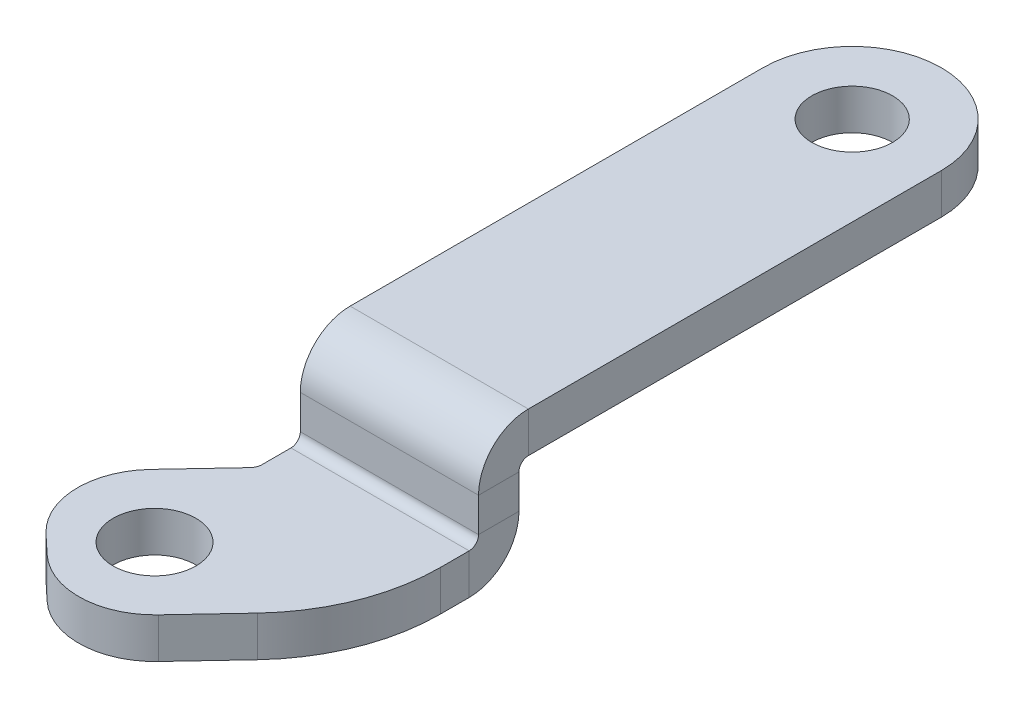
ISO-10303-21;
HEADER;
FILE_DESCRIPTION(('STEP AP214'),'2;1');
FILE_NAME('part.step','',(''),(''),'','','');
FILE_SCHEMA(('AUTOMOTIVE_DESIGN { 1 0 10303 214 1 1 1 1 }'));
ENDSEC;
DATA;
#1=APPLICATION_CONTEXT('core data for automotive mechanical design processes');
#2=APPLICATION_PROTOCOL_DEFINITION('international standard','automotive_design',2000,#1);
#3=PRODUCT_CONTEXT('',#1,'mechanical');
#4=PRODUCT('Part','Part','',(#3));
#5=PRODUCT_RELATED_PRODUCT_CATEGORY('part','',(#4));
#6=PRODUCT_DEFINITION_FORMATION('','',#4);
#7=PRODUCT_DEFINITION_CONTEXT('part definition',#1,'design');
#8=PRODUCT_DEFINITION('design','',#6,#7);
#9=PRODUCT_DEFINITION_SHAPE('','',#8);
#10=(LENGTH_UNIT() NAMED_UNIT(*) SI_UNIT(.MILLI.,.METRE.));
#11=(NAMED_UNIT(*) PLANE_ANGLE_UNIT() SI_UNIT($,.RADIAN.));
#12=(NAMED_UNIT(*) SI_UNIT($,.STERADIAN.) SOLID_ANGLE_UNIT());
#13=UNCERTAINTY_MEASURE_WITH_UNIT(LENGTH_MEASURE(1.E-05),#10,'distance_accuracy_value','');
#14=(GEOMETRIC_REPRESENTATION_CONTEXT(3) GLOBAL_UNCERTAINTY_ASSIGNED_CONTEXT((#13)) GLOBAL_UNIT_ASSIGNED_CONTEXT((#10,
#11,#12)) REPRESENTATION_CONTEXT('',''));
#15=CARTESIAN_POINT('',(0.,0.,0.));
#16=DIRECTION('',(0.,0.,1.));
#17=DIRECTION('',(1.,0.,0.));
#18=AXIS2_PLACEMENT_3D('',#15,#16,#17);
#19=CARTESIAN_POINT('',(0.,7.32499481379612,0.));
#20=DIRECTION('',(0.,-1.,0.));
#21=DIRECTION('',(0.,0.,-1.));
#22=AXIS2_PLACEMENT_3D('',#19,#20,#21);
#23=PLANE('',#22);
#24=DIRECTION('',(0.,0.,-1.));
#25=VECTOR('',#24,1.);
#26=CARTESIAN_POINT('',(12.9500036071504,7.32499481379612,0.));
#27=LINE('',#26,#25);
#28=CARTESIAN_POINT('',(12.9500036071504,7.32499481379612,-16.4116));
#29=VERTEX_POINT('',#28);
#30=CARTESIAN_POINT('',(12.9500036071504,7.32499481379612,-48.8499986312992));
#31=VERTEX_POINT('',#30);
#32=EDGE_CURVE('E261',#29,#31,#27,.T.);
#33=ORIENTED_EDGE('',*,*,#32,.T.);
#34=CARTESIAN_POINT('',(5.9500036071504,7.32499481379612,-48.8499986312992));
#35=DIRECTION('',(0.,1.,0.));
#36=DIRECTION('',(0.,0.,1.));
#37=AXIS2_PLACEMENT_3D('',#34,#35,#36);
#38=CIRCLE('',#37,7.);
#39=CARTESIAN_POINT('',(-1.0499963928496,7.32499481379612,-48.8499986312992));
#40=VERTEX_POINT('',#39);
#41=EDGE_CURVE('E244',#40,#31,#38,.F.);
#42=ORIENTED_EDGE('',*,*,#41,.F.);
#43=DIRECTION('',(0.,0.,1.));
#44=VECTOR('',#43,1.);
#45=CARTESIAN_POINT('',(-1.04999639284959,7.32499481379612,0.));
#46=LINE('',#45,#44);
#47=CARTESIAN_POINT('',(-1.0499963928496,7.32499481379612,-16.4116));
#48=VERTEX_POINT('',#47);
#49=EDGE_CURVE('E259',#40,#48,#46,.T.);
#50=ORIENTED_EDGE('',*,*,#49,.T.);
#51=DIRECTION('',(1.,0.,0.));
#52=VECTOR('',#51,1.);
#53=CARTESIAN_POINT('',(-1.0499963928496,7.32499481379612,-16.4116));
#54=LINE('',#53,#52);
#55=EDGE_CURVE('E263',#29,#48,#54,.F.);
#56=ORIENTED_EDGE('',*,*,#55,.F.);
#57=EDGE_LOOP('',(#33,#42,#50,#56));
#58=FACE_BOUND('',#57,.T.);
#59=CARTESIAN_POINT('',(5.9500036071504,7.32499481379612,-48.8499986312992));
#60=DIRECTION('',(0.,1.,0.));
#61=DIRECTION('',(0.,0.,1.));
#62=AXIS2_PLACEMENT_3D('',#59,#60,#61);
#63=CIRCLE('',#62,3.175);
#64=CARTESIAN_POINT('',(5.9500036071504,7.32499481379612,-45.6749986312992));
#65=VERTEX_POINT('',#64);
#66=EDGE_CURVE('E794',#65,#65,#63,.T.);
#67=ORIENTED_EDGE('',*,*,#66,.F.);
#68=EDGE_LOOP('',(#67));
#69=FACE_BOUND('',#68,.T.);
#70=ADVANCED_FACE('F105',(#58,#69),#23,.F.);
#71=CARTESIAN_POINT('',(0.,4.14999481379613,0.));
#72=DIRECTION('',(0.,-1.,0.));
#73=DIRECTION('',(0.,0.,-1.));
#74=AXIS2_PLACEMENT_3D('',#71,#72,#73);
#75=PLANE('',#74);
#76=CARTESIAN_POINT('',(5.9500036071504,4.14999481379612,-48.8499986312992));
#77=DIRECTION('',(0.,1.,0.));
#78=DIRECTION('',(0.,0.,1.));
#79=AXIS2_PLACEMENT_3D('',#76,#77,#78);
#80=CIRCLE('',#79,7.);
#81=CARTESIAN_POINT('',(-1.0499963928496,4.14999481379612,-48.8499986312992));
#82=VERTEX_POINT('',#81);
#83=CARTESIAN_POINT('',(12.9500036071504,4.14999481379612,-48.8499986312992));
#84=VERTEX_POINT('',#83);
#85=EDGE_CURVE('E233',#82,#84,#80,.F.);
#86=ORIENTED_EDGE('',*,*,#85,.T.);
#87=DIRECTION('',(0.,0.,1.));
#88=VECTOR('',#87,1.);
#89=CARTESIAN_POINT('',(12.9500036071504,4.14999481379612,-55.8499986312992));
#90=LINE('',#89,#88);
#91=CARTESIAN_POINT('',(12.9500036071504,4.14999481379612,-16.4116));
#92=VERTEX_POINT('',#91);
#93=EDGE_CURVE('E239',#92,#84,#90,.F.);
#94=ORIENTED_EDGE('',*,*,#93,.F.);
#95=DIRECTION('',(1.,0.,0.));
#96=VECTOR('',#95,1.);
#97=CARTESIAN_POINT('',(-1.0499963928496,4.14999481379612,-16.4116));
#98=LINE('',#97,#96);
#99=CARTESIAN_POINT('',(-1.0499963928496,4.14999481379612,-16.4116));
#100=VERTEX_POINT('',#99);
#101=EDGE_CURVE('E269',#100,#92,#98,.T.);
#102=ORIENTED_EDGE('',*,*,#101,.F.);
#103=DIRECTION('',(0.,0.,-1.));
#104=VECTOR('',#103,1.);
#105=CARTESIAN_POINT('',(-1.0499963928496,4.14999481379612,-15.675));
#106=LINE('',#105,#104);
#107=EDGE_CURVE('E240',#82,#100,#106,.F.);
#108=ORIENTED_EDGE('',*,*,#107,.F.);
#109=EDGE_LOOP('',(#86,#94,#102,#108));
#110=FACE_BOUND('',#109,.T.);
#111=CARTESIAN_POINT('',(5.9500036071504,4.14999481379612,-48.8499986312992));
#112=DIRECTION('',(0.,1.,0.));
#113=DIRECTION('',(0.,0.,1.));
#114=AXIS2_PLACEMENT_3D('',#111,#112,#113);
#115=CIRCLE('',#114,3.175);
#116=CARTESIAN_POINT('',(5.9500036071504,4.14999481379612,-45.6749986312992));
#117=VERTEX_POINT('',#116);
#118=EDGE_CURVE('E253',#117,#117,#115,.T.);
#119=ORIENTED_EDGE('',*,*,#118,.T.);
#120=EDGE_LOOP('',(#119));
#121=FACE_BOUND('',#120,.T.);
#122=ADVANCED_FACE('F235',(#110,#121),#75,.T.);
#123=CARTESIAN_POINT('',(12.9500036071504,7.32499481379612,-55.8499986312992));
#124=DIRECTION('',(-1.,0.,0.));
#125=DIRECTION('',(0.,0.,1.));
#126=AXIS2_PLACEMENT_3D('',#123,#124,#125);
#127=PLANE('',#126);
#128=DIRECTION('',(0.,1.,0.));
#129=VECTOR('',#128,1.);
#130=CARTESIAN_POINT('',(12.9500036071504,4.14999481379612,-48.8499986312992));
#131=LINE('',#130,#129);
#132=EDGE_CURVE('E247',#84,#31,#131,.T.);
#133=ORIENTED_EDGE('',*,*,#132,.T.);
#134=ORIENTED_EDGE('',*,*,#32,.F.);
#135=DIRECTION('',(0.,-1.,0.));
#136=VECTOR('',#135,1.);
#137=CARTESIAN_POINT('',(12.9500036071504,4.14999481379612,-16.4116));
#138=LINE('',#137,#136);
#139=EDGE_CURVE('E258',#92,#29,#138,.F.);
#140=ORIENTED_EDGE('',*,*,#139,.F.);
#141=ORIENTED_EDGE('',*,*,#93,.T.);
#142=EDGE_LOOP('',(#133,#134,#140,#141));
#143=FACE_BOUND('',#142,.T.);
#144=ADVANCED_FACE('F256',(#143),#127,.F.);
#145=CARTESIAN_POINT('',(12.9500036071504,0.,-15.675));
#146=DIRECTION('',(-1.,0.,0.));
#147=DIRECTION('',(0.,0.,1.));
#148=AXIS2_PLACEMENT_3D('',#145,#146,#147);
#149=PLANE('',#148);
#150=DIRECTION('',(0.,0.,1.));
#151=VECTOR('',#150,1.);
#152=CARTESIAN_POINT('',(12.9500036071504,3.41339481379613,-15.675));
#153=LINE('',#152,#151);
#154=CARTESIAN_POINT('',(12.9500036071504,3.41339481379613,-15.675));
#155=VERTEX_POINT('',#154);
#156=CARTESIAN_POINT('',(12.9500036071504,3.41339481379614,-12.5));
#157=VERTEX_POINT('',#156);
#158=EDGE_CURVE('E279',#155,#157,#153,.T.);
#159=ORIENTED_EDGE('',*,*,#158,.T.);
#160=DIRECTION('',(0.,-1.,0.));
#161=VECTOR('',#160,1.);
#162=CARTESIAN_POINT('',(12.9500036071504,0.,-12.5));
#163=LINE('',#162,#161);
#164=CARTESIAN_POINT('',(12.9500036071504,0.736599999999989,-12.5));
#165=VERTEX_POINT('',#164);
#166=EDGE_CURVE('E305',#157,#165,#163,.T.);
#167=ORIENTED_EDGE('',*,*,#166,.T.);
#168=DIRECTION('',(0.,0.,-1.));
#169=VECTOR('',#168,1.);
#170=CARTESIAN_POINT('',(12.9500036071504,0.736599999999997,-12.5));
#171=LINE('',#170,#169);
#172=CARTESIAN_POINT('',(12.9500036071504,0.736599999999978,-15.675));
#173=VERTEX_POINT('',#172);
#174=EDGE_CURVE('E292',#165,#173,#171,.T.);
#175=ORIENTED_EDGE('',*,*,#174,.T.);
#176=DIRECTION('',(0.,-1.,0.));
#177=VECTOR('',#176,1.);
#178=CARTESIAN_POINT('',(12.9500036071504,0.,-15.675));
#179=LINE('',#178,#177);
#180=EDGE_CURVE('E306',#155,#173,#179,.T.);
#181=ORIENTED_EDGE('',*,*,#180,.F.);
#182=EDGE_LOOP('',(#159,#167,#175,#181));
#183=FACE_BOUND('',#182,.T.);
#184=ADVANCED_FACE('F437',(#183),#149,.F.);
#185=CARTESIAN_POINT('',(-1.0499963928496,7.32499481379612,-15.675));
#186=DIRECTION('',(1.,0.,0.));
#187=DIRECTION('',(0.,0.,-1.));
#188=AXIS2_PLACEMENT_3D('',#185,#186,#187);
#189=PLANE('',#188);
#190=DIRECTION('',(0.,0.,1.));
#191=VECTOR('',#190,1.);
#192=CARTESIAN_POINT('',(-1.0499963928496,3.41339481379613,-15.675));
#193=LINE('',#192,#191);
#194=CARTESIAN_POINT('',(-1.0499963928496,3.41339481379613,-15.675));
#195=VERTEX_POINT('',#194);
#196=CARTESIAN_POINT('',(-1.0499963928496,3.41339481379613,-12.5));
#197=VERTEX_POINT('',#196);
#198=EDGE_CURVE('E290',#195,#197,#193,.T.);
#199=ORIENTED_EDGE('',*,*,#198,.F.);
#200=DIRECTION('',(0.,1.,0.));
#201=VECTOR('',#200,1.);
#202=CARTESIAN_POINT('',(-1.0499963928496,7.32499481379612,-15.675));
#203=LINE('',#202,#201);
#204=CARTESIAN_POINT('',(-1.0499963928496,0.736600000000019,-15.675));
#205=VERTEX_POINT('',#204);
#206=EDGE_CURVE('E308',#205,#195,#203,.T.);
#207=ORIENTED_EDGE('',*,*,#206,.F.);
#208=DIRECTION('',(0.,0.,-1.));
#209=VECTOR('',#208,1.);
#210=CARTESIAN_POINT('',(-1.0499963928496,0.736599999999997,-12.5));
#211=LINE('',#210,#209);
#212=CARTESIAN_POINT('',(-1.0499963928496,0.736599999999989,-12.5));
#213=VERTEX_POINT('',#212);
#214=EDGE_CURVE('E297',#213,#205,#211,.T.);
#215=ORIENTED_EDGE('',*,*,#214,.F.);
#216=DIRECTION('',(0.,1.,0.));
#217=VECTOR('',#216,1.);
#218=CARTESIAN_POINT('',(-1.0499963928496,7.32499481379613,-12.5));
#219=LINE('',#218,#217);
#220=EDGE_CURVE('E309',#213,#197,#219,.T.);
#221=ORIENTED_EDGE('',*,*,#220,.T.);
#222=EDGE_LOOP('',(#199,#207,#215,#221));
#223=FACE_BOUND('',#222,.T.);
#224=ADVANCED_FACE('F450',(#223),#189,.F.);
#225=CARTESIAN_POINT('',(0.,0.,-15.675));
#226=DIRECTION('',(0.,0.,1.));
#227=DIRECTION('',(0.,-1.,0.));
#228=AXIS2_PLACEMENT_3D('',#225,#226,#227);
#229=PLANE('',#228);
#230=DIRECTION('',(1.,0.,0.));
#231=VECTOR('',#230,1.);
#232=CARTESIAN_POINT('',(12.9500036071504,3.41339481379613,-15.675));
#233=LINE('',#232,#231);
#234=EDGE_CURVE('E285',#155,#195,#233,.F.);
#235=ORIENTED_EDGE('',*,*,#234,.F.);
#236=ORIENTED_EDGE('',*,*,#180,.T.);
#237=DIRECTION('',(1.,0.,0.));
#238=VECTOR('',#237,1.);
#239=CARTESIAN_POINT('',(0.,0.736600000000019,-15.675));
#240=LINE('',#239,#238);
#241=EDGE_CURVE('E300',#205,#173,#240,.T.);
#242=ORIENTED_EDGE('',*,*,#241,.F.);
#243=ORIENTED_EDGE('',*,*,#206,.T.);
#244=EDGE_LOOP('',(#235,#236,#242,#243));
#245=FACE_BOUND('',#244,.T.);
#246=ADVANCED_FACE('F453',(#245),#229,.F.);
#247=CARTESIAN_POINT('',(0.,0.,-12.5));
#248=DIRECTION('',(0.,0.,1.));
#249=DIRECTION('',(0.,-1.,0.));
#250=AXIS2_PLACEMENT_3D('',#247,#248,#249);
#251=PLANE('',#250);
#252=ORIENTED_EDGE('',*,*,#166,.F.);
#253=DIRECTION('',(1.,0.,0.));
#254=VECTOR('',#253,1.);
#255=CARTESIAN_POINT('',(12.9500036071504,3.41339481379614,-12.5));
#256=LINE('',#255,#254);
#257=EDGE_CURVE('E274',#157,#197,#256,.F.);
#258=ORIENTED_EDGE('',*,*,#257,.T.);
#259=ORIENTED_EDGE('',*,*,#220,.F.);
#260=DIRECTION('',(-1.,0.,0.));
#261=VECTOR('',#260,1.);
#262=CARTESIAN_POINT('',(12.9500036071504,0.736599999999997,-12.5));
#263=LINE('',#262,#261);
#264=EDGE_CURVE('E295',#165,#213,#263,.T.);
#265=ORIENTED_EDGE('',*,*,#264,.F.);
#266=EDGE_LOOP('',(#252,#258,#259,#265));
#267=FACE_BOUND('',#266,.T.);
#268=ADVANCED_FACE('F440',(#267),#251,.T.);
#269=CARTESIAN_POINT('',(-1.0499963928496,-3.175,-9.50000000000001));
#270=DIRECTION('',(-1.,0.,0.));
#271=DIRECTION('',(0.,0.,1.));
#272=AXIS2_PLACEMENT_3D('',#269,#270,#271);
#273=PLANE('',#272);
#274=DIRECTION('',(0.,0.,1.));
#275=VECTOR('',#274,1.);
#276=CARTESIAN_POINT('',(-1.0499963928496,0.,-9.50000000000001));
#277=LINE('',#276,#275);
#278=CARTESIAN_POINT('',(-1.0499963928496,0.,-11.7634));
#279=VERTEX_POINT('',#278);
#280=CARTESIAN_POINT('',(-1.0499963928496,0.,-9.50000000000001));
#281=VERTEX_POINT('',#280);
#282=EDGE_CURVE('E380',#279,#281,#277,.T.);
#283=ORIENTED_EDGE('',*,*,#282,.F.);
#284=DIRECTION('',(0.,-1.,0.));
#285=VECTOR('',#284,1.);
#286=CARTESIAN_POINT('',(-1.0499963928496,0.,-11.7634));
#287=LINE('',#286,#285);
#288=CARTESIAN_POINT('',(-1.0499963928496,-3.17500000000001,-11.7634));
#289=VERTEX_POINT('',#288);
#290=EDGE_CURVE('E322',#279,#289,#287,.T.);
#291=ORIENTED_EDGE('',*,*,#290,.T.);
#292=DIRECTION('',(0.,0.,1.));
#293=VECTOR('',#292,1.);
#294=CARTESIAN_POINT('',(-1.0499963928496,-3.175,-9.50000000000001));
#295=LINE('',#294,#293);
#296=CARTESIAN_POINT('',(-1.0499963928496,-3.175,-9.50000000000001));
#297=VERTEX_POINT('',#296);
#298=EDGE_CURVE('E356',#289,#297,#295,.T.);
#299=ORIENTED_EDGE('',*,*,#298,.T.);
#300=DIRECTION('',(0.,1.,0.));
#301=VECTOR('',#300,1.);
#302=CARTESIAN_POINT('',(-1.0499963928496,-3.175,-9.50000000000001));
#303=LINE('',#302,#301);
#304=EDGE_CURVE('E398',#297,#281,#303,.T.);
#305=ORIENTED_EDGE('',*,*,#304,.T.);
#306=EDGE_LOOP('',(#283,#291,#299,#305));
#307=FACE_BOUND('',#306,.T.);
#308=ADVANCED_FACE('F509',(#307),#273,.T.);
#309=CARTESIAN_POINT('',(0.728668524885231,-3.175,0.68486654235813));
#310=DIRECTION('',(0.,1.,0.));
#311=DIRECTION('',(0.,0.,1.));
#312=AXIS2_PLACEMENT_3D('',#309,#310,#311);
#313=PLANE('',#312);
#314=CARTESIAN_POINT('',(0.,-3.175,0.));
#315=DIRECTION('',(0.,1.,0.));
#316=DIRECTION('',(0.,0.,1.));
#317=AXIS2_PLACEMENT_3D('',#314,#315,#316);
#318=CIRCLE('',#317,3.25);
#319=CARTESIAN_POINT('',(0.,-3.175,3.25));
#320=VERTEX_POINT('',#319);
#321=EDGE_CURVE('E337',#320,#320,#318,.T.);
#322=ORIENTED_EDGE('',*,*,#321,.T.);
#323=EDGE_LOOP('',(#322));
#324=FACE_BOUND('',#323,.T.);
#325=DIRECTION('',(-1.,0.,0.));
#326=VECTOR('',#325,1.);
#327=CARTESIAN_POINT('',(-1.0499963928496,-3.17500000000001,-11.7634));
#328=LINE('',#327,#326);
#329=CARTESIAN_POINT('',(12.9500036071504,-3.175,-11.7634));
#330=VERTEX_POINT('',#329);
#331=EDGE_CURVE('E316',#289,#330,#328,.F.);
#332=ORIENTED_EDGE('',*,*,#331,.T.);
#333=DIRECTION('',(0.,0.,-1.));
#334=VECTOR('',#333,1.);
#335=CARTESIAN_POINT('',(12.9500036071504,-3.175,-9.50000000000001));
#336=LINE('',#335,#334);
#337=CARTESIAN_POINT('',(12.9500036071504,-3.175,-9.50000000000001));
#338=VERTEX_POINT('',#337);
#339=EDGE_CURVE('E353',#338,#330,#336,.T.);
#340=ORIENTED_EDGE('',*,*,#339,.F.);
#341=CARTESIAN_POINT('',(-2.04999639284959,-3.175,-9.50000000000001));
#342=DIRECTION('',(0.,1.,0.));
#343=DIRECTION('',(0.,0.,1.));
#344=AXIS2_PLACEMENT_3D('',#341,#342,#343);
#345=CIRCLE('',#344,15.);
#346=CARTESIAN_POINT('',(8.88003148042888,-3.175,0.772998135371942));
#347=VERTEX_POINT('',#346);
#348=EDGE_CURVE('E350',#347,#338,#345,.T.);
#349=ORIENTED_EDGE('',*,*,#348,.F.);
#350=DIRECTION('',(0.684866542358128,0.,-0.728668524885234));
#351=VECTOR('',#350,1.);
#352=CARTESIAN_POINT('',(5.10067967419663,-3.175,4.79406579650691));
#353=LINE('',#352,#351);
#354=CARTESIAN_POINT('',(5.10067967419663,-3.175,4.79406579650691));
#355=VERTEX_POINT('',#354);
#356=EDGE_CURVE('E346',#355,#347,#353,.T.);
#357=ORIENTED_EDGE('',*,*,#356,.F.);
#358=CARTESIAN_POINT('',(0.728668524885231,-3.175,0.68486654235813));
#359=DIRECTION('',(0.,1.,0.));
#360=DIRECTION('',(0.,0.,1.));
#361=AXIS2_PLACEMENT_3D('',#358,#359,#360);
#362=CIRCLE('',#361,6.);
#363=CARTESIAN_POINT('',(-3.38053072926355,-3.175,5.05687769166952));
#364=VERTEX_POINT('',#363);
#365=EDGE_CURVE('E343',#364,#355,#362,.T.);
#366=ORIENTED_EDGE('',*,*,#365,.F.);
#367=DIRECTION('',(0.728668524885232,0.,0.68486654235813));
#368=VECTOR('',#367,1.);
#369=CARTESIAN_POINT('',(-3.38053072926355,-3.175,5.05687769166952));
#370=LINE('',#369,#368);
#371=CARTESIAN_POINT('',(-4.83786777903401,-3.175,3.68714460695326));
#372=VERTEX_POINT('',#371);
#373=EDGE_CURVE('E367',#372,#364,#370,.T.);
#374=ORIENTED_EDGE('',*,*,#373,.F.);
#375=CARTESIAN_POINT('',(-0.728668524885232,-3.175,-0.68486654235813));
#376=DIRECTION('',(0.,1.,0.));
#377=DIRECTION('',(0.,0.,-1.));
#378=AXIS2_PLACEMENT_3D('',#375,#376,#377);
#379=CIRCLE('',#378,6.00000000000001);
#380=CARTESIAN_POINT('',(-5.10067967419663,-3.175,-4.79406579650691));
#381=VERTEX_POINT('',#380);
#382=EDGE_CURVE('E364',#381,#372,#379,.T.);
#383=ORIENTED_EDGE('',*,*,#382,.F.);
#384=DIRECTION('',(-0.68486654235813,0.,0.728668524885232));
#385=VECTOR('',#384,1.);
#386=CARTESIAN_POINT('',(-5.10067967419663,-3.175,-4.79406579650692));
#387=LINE('',#386,#385);
#388=CARTESIAN_POINT('',(-1.32132786796437,-3.175,-8.81513345764188));
#389=VERTEX_POINT('',#388);
#390=EDGE_CURVE('E361',#389,#381,#387,.T.);
#391=ORIENTED_EDGE('',*,*,#390,.F.);
#392=CARTESIAN_POINT('',(-2.04999639284959,-3.175,-9.50000000000001));
#393=DIRECTION('',(0.,-1.,0.));
#394=DIRECTION('',(0.,0.,1.));
#395=AXIS2_PLACEMENT_3D('',#392,#393,#394);
#396=CIRCLE('',#395,0.999999999999994);
#397=EDGE_CURVE('E358',#297,#389,#396,.T.);
#398=ORIENTED_EDGE('',*,*,#397,.F.);
#399=ORIENTED_EDGE('',*,*,#298,.F.);
#400=EDGE_LOOP('',(#332,#340,#349,#357,#366,#374,#383,#391,#398,#399));
#401=FACE_BOUND('',#400,.T.);
#402=ADVANCED_FACE('F418',(#324,#401),#313,.F.);
#403=CARTESIAN_POINT('',(0.728668524885231,0.,0.68486654235813));
#404=DIRECTION('',(0.,1.,0.));
#405=DIRECTION('',(0.,0.,1.));
#406=AXIS2_PLACEMENT_3D('',#403,#404,#405);
#407=PLANE('',#406);
#408=CARTESIAN_POINT('',(0.,0.,0.));
#409=DIRECTION('',(0.,1.,0.));
#410=DIRECTION('',(0.,0.,1.));
#411=AXIS2_PLACEMENT_3D('',#408,#409,#410);
#412=CIRCLE('',#411,3.25);
#413=CARTESIAN_POINT('',(0.,0.,3.25));
#414=VERTEX_POINT('',#413);
#415=EDGE_CURVE('E334',#414,#414,#412,.T.);
#416=ORIENTED_EDGE('',*,*,#415,.F.);
#417=EDGE_LOOP('',(#416));
#418=FACE_BOUND('',#417,.T.);
#419=DIRECTION('',(0.,0.,-1.));
#420=VECTOR('',#419,1.);
#421=CARTESIAN_POINT('',(12.9500036071504,0.,-9.50000000000001));
#422=LINE('',#421,#420);
#423=CARTESIAN_POINT('',(12.9500036071504,0.,-9.50000000000001));
#424=VERTEX_POINT('',#423);
#425=CARTESIAN_POINT('',(12.9500036071504,0.,-11.7634));
#426=VERTEX_POINT('',#425);
#427=EDGE_CURVE('E378',#424,#426,#422,.T.);
#428=ORIENTED_EDGE('',*,*,#427,.T.);
#429=DIRECTION('',(-1.,0.,0.));
#430=VECTOR('',#429,1.);
#431=CARTESIAN_POINT('',(-1.0499963928496,0.,-11.7634));
#432=LINE('',#431,#430);
#433=EDGE_CURVE('E130',#279,#426,#432,.F.);
#434=ORIENTED_EDGE('',*,*,#433,.F.);
#435=ORIENTED_EDGE('',*,*,#282,.T.);
#436=CARTESIAN_POINT('',(-2.04999639284959,0.,-9.50000000000001));
#437=DIRECTION('',(0.,-1.,0.));
#438=DIRECTION('',(0.,0.,1.));
#439=AXIS2_PLACEMENT_3D('',#436,#437,#438);
#440=CIRCLE('',#439,0.999999999999994);
#441=CARTESIAN_POINT('',(-1.32132786796437,0.,-8.81513345764188));
#442=VERTEX_POINT('',#441);
#443=EDGE_CURVE('E382',#281,#442,#440,.T.);
#444=ORIENTED_EDGE('',*,*,#443,.T.);
#445=DIRECTION('',(-0.68486654235813,0.,0.728668524885232));
#446=VECTOR('',#445,1.);
#447=CARTESIAN_POINT('',(-5.10067967419663,0.,-4.79406579650692));
#448=LINE('',#447,#446);
#449=CARTESIAN_POINT('',(-5.10067967419663,0.,-4.79406579650691));
#450=VERTEX_POINT('',#449);
#451=EDGE_CURVE('E385',#442,#450,#448,.T.);
#452=ORIENTED_EDGE('',*,*,#451,.T.);
#453=CARTESIAN_POINT('',(-0.728668524885232,0.,-0.68486654235813));
#454=DIRECTION('',(0.,1.,0.));
#455=DIRECTION('',(0.,0.,-1.));
#456=AXIS2_PLACEMENT_3D('',#453,#454,#455);
#457=CIRCLE('',#456,6.00000000000001);
#458=CARTESIAN_POINT('',(-4.83786777903401,0.,3.68714460695326));
#459=VERTEX_POINT('',#458);
#460=EDGE_CURVE('E388',#450,#459,#457,.T.);
#461=ORIENTED_EDGE('',*,*,#460,.T.);
#462=DIRECTION('',(0.728668524885232,0.,0.68486654235813));
#463=VECTOR('',#462,1.);
#464=CARTESIAN_POINT('',(-3.38053072926355,0.,5.05687769166952));
#465=LINE('',#464,#463);
#466=CARTESIAN_POINT('',(-3.38053072926355,0.,5.05687769166952));
#467=VERTEX_POINT('',#466);
#468=EDGE_CURVE('E347',#459,#467,#465,.T.);
#469=ORIENTED_EDGE('',*,*,#468,.T.);
#470=CARTESIAN_POINT('',(0.728668524885231,0.,0.68486654235813));
#471=DIRECTION('',(0.,1.,0.));
#472=DIRECTION('',(0.,0.,1.));
#473=AXIS2_PLACEMENT_3D('',#470,#471,#472);
#474=CIRCLE('',#473,6.);
#475=CARTESIAN_POINT('',(5.10067967419663,0.,4.79406579650691));
#476=VERTEX_POINT('',#475);
#477=EDGE_CURVE('E340',#467,#476,#474,.T.);
#478=ORIENTED_EDGE('',*,*,#477,.T.);
#479=DIRECTION('',(0.684866542358128,0.,-0.728668524885234));
#480=VECTOR('',#479,1.);
#481=CARTESIAN_POINT('',(5.10067967419663,0.,4.79406579650691));
#482=LINE('',#481,#480);
#483=CARTESIAN_POINT('',(8.88003148042888,0.,0.772998135371942));
#484=VERTEX_POINT('',#483);
#485=EDGE_CURVE('E372',#476,#484,#482,.T.);
#486=ORIENTED_EDGE('',*,*,#485,.T.);
#487=CARTESIAN_POINT('',(-2.04999639284959,0.,-9.50000000000001));
#488=DIRECTION('',(0.,1.,0.));
#489=DIRECTION('',(0.,0.,1.));
#490=AXIS2_PLACEMENT_3D('',#487,#488,#489);
#491=CIRCLE('',#490,15.);
#492=EDGE_CURVE('E375',#484,#424,#491,.T.);
#493=ORIENTED_EDGE('',*,*,#492,.T.);
#494=EDGE_LOOP('',(#428,#434,#435,#444,#452,#461,#469,#478,#486,#493));
#495=FACE_BOUND('',#494,.T.);
#496=ADVANCED_FACE('F411',(#418,#495),#407,.T.);
#497=CARTESIAN_POINT('',(0.728668524885231,-3.175,0.68486654235813));
#498=DIRECTION('',(0.,1.,0.));
#499=DIRECTION('',(0.,0.,1.));
#500=AXIS2_PLACEMENT_3D('',#497,#498,#499);
#501=CYLINDRICAL_SURFACE('',#500,6.);
#502=ORIENTED_EDGE('',*,*,#477,.F.);
#503=DIRECTION('',(0.,1.,0.));
#504=VECTOR('',#503,1.);
#505=CARTESIAN_POINT('',(-3.38053072926355,-3.175,5.05687769166952));
#506=LINE('',#505,#504);
#507=EDGE_CURVE('E13',#364,#467,#506,.T.);
#508=ORIENTED_EDGE('',*,*,#507,.F.);
#509=ORIENTED_EDGE('',*,*,#365,.T.);
#510=DIRECTION('',(0.,1.,0.));
#511=VECTOR('',#510,1.);
#512=CARTESIAN_POINT('',(5.10067967419663,-3.175,4.79406579650691));
#513=LINE('',#512,#511);
#514=EDGE_CURVE('E109',#355,#476,#513,.T.);
#515=ORIENTED_EDGE('',*,*,#514,.T.);
#516=EDGE_LOOP('',(#502,#508,#509,#515));
#517=FACE_BOUND('',#516,.T.);
#518=ADVANCED_FACE('F107',(#517),#501,.T.);
#519=CARTESIAN_POINT('',(-3.38053072926355,-3.175,5.05687769166952));
#520=DIRECTION('',(-0.68486654235813,0.,0.728668524885232));
#521=DIRECTION('',(0.728668524885232,0.,0.68486654235813));
#522=AXIS2_PLACEMENT_3D('',#519,#520,#521);
#523=PLANE('',#522);
#524=ORIENTED_EDGE('',*,*,#468,.F.);
#525=DIRECTION('',(0.,1.,0.));
#526=VECTOR('',#525,1.);
#527=CARTESIAN_POINT('',(-4.83786777903401,-3.175,3.68714460695326));
#528=LINE('',#527,#526);
#529=EDGE_CURVE('E114',#372,#459,#528,.T.);
#530=ORIENTED_EDGE('',*,*,#529,.F.);
#531=ORIENTED_EDGE('',*,*,#373,.T.);
#532=ORIENTED_EDGE('',*,*,#507,.T.);
#533=EDGE_LOOP('',(#524,#530,#531,#532));
#534=FACE_BOUND('',#533,.T.);
#535=ADVANCED_FACE('F415',(#534),#523,.T.);
#536=CARTESIAN_POINT('',(-0.728668524885232,-3.175,-0.68486654235813));
#537=DIRECTION('',(0.,1.,0.));
#538=DIRECTION('',(0.,0.,1.));
#539=AXIS2_PLACEMENT_3D('',#536,#537,#538);
#540=CYLINDRICAL_SURFACE('',#539,6.00000000000001);
#541=ORIENTED_EDGE('',*,*,#460,.F.);
#542=DIRECTION('',(0.,1.,0.));
#543=VECTOR('',#542,1.);
#544=CARTESIAN_POINT('',(-5.10067967419663,-3.175,-4.79406579650691));
#545=LINE('',#544,#543);
#546=EDGE_CURVE('E394',#381,#450,#545,.T.);
#547=ORIENTED_EDGE('',*,*,#546,.F.);
#548=ORIENTED_EDGE('',*,*,#382,.T.);
#549=ORIENTED_EDGE('',*,*,#529,.T.);
#550=EDGE_LOOP('',(#541,#547,#548,#549));
#551=FACE_BOUND('',#550,.T.);
#552=ADVANCED_FACE('F532',(#551),#540,.T.);
#553=CARTESIAN_POINT('',(-5.10067967419663,-3.175,-4.79406579650692));
#554=DIRECTION('',(-0.728668524885232,0.,-0.68486654235813));
#555=DIRECTION('',(-0.68486654235813,0.,0.728668524885232));
#556=AXIS2_PLACEMENT_3D('',#553,#554,#555);
#557=PLANE('',#556);
#558=ORIENTED_EDGE('',*,*,#451,.F.);
#559=DIRECTION('',(0.,1.,0.));
#560=VECTOR('',#559,1.);
#561=CARTESIAN_POINT('',(-1.32132786796437,-3.175,-8.81513345764188));
#562=LINE('',#561,#560);
#563=EDGE_CURVE('E396',#389,#442,#562,.T.);
#564=ORIENTED_EDGE('',*,*,#563,.F.);
#565=ORIENTED_EDGE('',*,*,#390,.T.);
#566=ORIENTED_EDGE('',*,*,#546,.T.);
#567=EDGE_LOOP('',(#558,#564,#565,#566));
#568=FACE_BOUND('',#567,.T.);
#569=ADVANCED_FACE('F469',(#568),#557,.T.);
#570=CARTESIAN_POINT('',(-2.04999639284959,-3.175,-9.50000000000001));
#571=DIRECTION('',(0.,1.,0.));
#572=DIRECTION('',(0.,0.,1.));
#573=AXIS2_PLACEMENT_3D('',#570,#571,#572);
#574=CYLINDRICAL_SURFACE('',#573,0.999999999999994);
#575=ORIENTED_EDGE('',*,*,#443,.F.);
#576=ORIENTED_EDGE('',*,*,#304,.F.);
#577=ORIENTED_EDGE('',*,*,#397,.T.);
#578=ORIENTED_EDGE('',*,*,#563,.T.);
#579=EDGE_LOOP('',(#575,#576,#577,#578));
#580=FACE_BOUND('',#579,.T.);
#581=ADVANCED_FACE('F460',(#580),#574,.F.);
#582=CARTESIAN_POINT('',(12.9500036071504,-3.175,-9.50000000000001));
#583=DIRECTION('',(1.,0.,0.));
#584=DIRECTION('',(0.,0.,-1.));
#585=AXIS2_PLACEMENT_3D('',#582,#583,#584);
#586=PLANE('',#585);
#587=DIRECTION('',(0.,-1.,0.));
#588=VECTOR('',#587,1.);
#589=CARTESIAN_POINT('',(12.9500036071504,0.,-11.7634));
#590=LINE('',#589,#588);
#591=EDGE_CURVE('E331',#426,#330,#590,.T.);
#592=ORIENTED_EDGE('',*,*,#591,.F.);
#593=ORIENTED_EDGE('',*,*,#427,.F.);
#594=DIRECTION('',(0.,1.,0.));
#595=VECTOR('',#594,1.);
#596=CARTESIAN_POINT('',(12.9500036071504,-3.175,-9.50000000000001));
#597=LINE('',#596,#595);
#598=EDGE_CURVE('E401',#338,#424,#597,.T.);
#599=ORIENTED_EDGE('',*,*,#598,.F.);
#600=ORIENTED_EDGE('',*,*,#339,.T.);
#601=EDGE_LOOP('',(#592,#593,#599,#600));
#602=FACE_BOUND('',#601,.T.);
#603=ADVANCED_FACE('F458',(#602),#586,.T.);
#604=CARTESIAN_POINT('',(-2.04999639284959,-3.175,-9.50000000000001));
#605=DIRECTION('',(0.,1.,0.));
#606=DIRECTION('',(0.,0.,1.));
#607=AXIS2_PLACEMENT_3D('',#604,#605,#606);
#608=CYLINDRICAL_SURFACE('',#607,15.);
#609=ORIENTED_EDGE('',*,*,#492,.F.);
#610=DIRECTION('',(0.,1.,0.));
#611=VECTOR('',#610,1.);
#612=CARTESIAN_POINT('',(8.88003148042888,-3.175,0.772998135371942));
#613=LINE('',#612,#611);
#614=EDGE_CURVE('E402',#347,#484,#613,.T.);
#615=ORIENTED_EDGE('',*,*,#614,.F.);
#616=ORIENTED_EDGE('',*,*,#348,.T.);
#617=ORIENTED_EDGE('',*,*,#598,.T.);
#618=EDGE_LOOP('',(#609,#615,#616,#617));
#619=FACE_BOUND('',#618,.T.);
#620=ADVANCED_FACE('F423',(#619),#608,.T.);
#621=CARTESIAN_POINT('',(5.10067967419663,-3.175,4.79406579650691));
#622=DIRECTION('',(0.728668524885234,0.,0.684866542358128));
#623=DIRECTION('',(0.684866542358128,0.,-0.728668524885234));
#624=AXIS2_PLACEMENT_3D('',#621,#622,#623);
#625=PLANE('',#624);
#626=ORIENTED_EDGE('',*,*,#485,.F.);
#627=ORIENTED_EDGE('',*,*,#514,.F.);
#628=ORIENTED_EDGE('',*,*,#356,.T.);
#629=ORIENTED_EDGE('',*,*,#614,.T.);
#630=EDGE_LOOP('',(#626,#627,#628,#629));
#631=FACE_BOUND('',#630,.T.);
#632=ADVANCED_FACE('F410',(#631),#625,.T.);
#633=CARTESIAN_POINT('',(0.,-3.175,0.));
#634=DIRECTION('',(0.,1.,0.));
#635=DIRECTION('',(0.,0.,1.));
#636=AXIS2_PLACEMENT_3D('',#633,#634,#635);
#637=CYLINDRICAL_SURFACE('',#636,3.25);
#638=ORIENTED_EDGE('',*,*,#321,.F.);
#639=EDGE_LOOP('',(#638));
#640=FACE_BOUND('',#639,.T.);
#641=ORIENTED_EDGE('',*,*,#415,.T.);
#642=EDGE_LOOP('',(#641));
#643=FACE_BOUND('',#642,.T.);
#644=ADVANCED_FACE('F519',(#640,#643),#637,.F.);
#645=CARTESIAN_POINT('',(12.9500036071504,0.736599999999992,-11.7634));
#646=DIRECTION('',(1.,0.,0.));
#647=DIRECTION('',(0.,0.,-1.));
#648=AXIS2_PLACEMENT_3D('',#645,#646,#647);
#649=PLANE('',#648);
#650=ORIENTED_EDGE('',*,*,#174,.F.);
#651=CARTESIAN_POINT('',(12.9500036071504,0.736599999999992,-11.7634));
#652=DIRECTION('',(-1.,0.,0.));
#653=DIRECTION('',(0.,0.,1.));
#654=AXIS2_PLACEMENT_3D('',#651,#652,#653);
#655=CIRCLE('',#654,0.736600000000004);
#656=EDGE_CURVE('E325',#426,#165,#655,.F.);
#657=ORIENTED_EDGE('',*,*,#656,.F.);
#658=ORIENTED_EDGE('',*,*,#591,.T.);
#659=CARTESIAN_POINT('',(12.9500036071504,0.736599999999992,-11.7634));
#660=DIRECTION('',(-1.,0.,0.));
#661=DIRECTION('',(0.,0.,1.));
#662=AXIS2_PLACEMENT_3D('',#659,#660,#661);
#663=CIRCLE('',#662,3.9116);
#664=EDGE_CURVE('E318',#330,#173,#663,.F.);
#665=ORIENTED_EDGE('',*,*,#664,.T.);
#666=EDGE_LOOP('',(#650,#657,#658,#665));
#667=FACE_BOUND('',#666,.T.);
#668=ADVANCED_FACE('F433',(#667),#649,.T.);
#669=CARTESIAN_POINT('',(-1.0499963928496,0.736599999999992,-11.7634));
#670=DIRECTION('',(1.,0.,0.));
#671=DIRECTION('',(0.,0.,-1.));
#672=AXIS2_PLACEMENT_3D('',#669,#670,#671);
#673=PLANE('',#672);
#674=CARTESIAN_POINT('',(-1.0499963928496,0.736599999999992,-11.7634));
#675=DIRECTION('',(-1.,0.,0.));
#676=DIRECTION('',(0.,0.,1.));
#677=AXIS2_PLACEMENT_3D('',#674,#675,#676);
#678=CIRCLE('',#677,0.736600000000004);
#679=EDGE_CURVE('E312',#213,#279,#678,.T.);
#680=ORIENTED_EDGE('',*,*,#679,.F.);
#681=ORIENTED_EDGE('',*,*,#214,.T.);
#682=CARTESIAN_POINT('',(-1.0499963928496,0.736599999999992,-11.7634));
#683=DIRECTION('',(-1.,0.,0.));
#684=DIRECTION('',(0.,0.,1.));
#685=AXIS2_PLACEMENT_3D('',#682,#683,#684);
#686=CIRCLE('',#685,3.9116);
#687=EDGE_CURVE('E319',#205,#289,#686,.T.);
#688=ORIENTED_EDGE('',*,*,#687,.T.);
#689=ORIENTED_EDGE('',*,*,#290,.F.);
#690=EDGE_LOOP('',(#680,#681,#688,#689));
#691=FACE_BOUND('',#690,.T.);
#692=ADVANCED_FACE('F445',(#691),#673,.F.);
#693=CARTESIAN_POINT('',(-1.0499963928496,0.736599999999992,-11.7634));
#694=DIRECTION('',(-1.,0.,0.));
#695=DIRECTION('',(0.,0.,-1.));
#696=AXIS2_PLACEMENT_3D('',#693,#694,#695);
#697=CYLINDRICAL_SURFACE('',#696,3.9116);
#698=ORIENTED_EDGE('',*,*,#331,.F.);
#699=ORIENTED_EDGE('',*,*,#687,.F.);
#700=ORIENTED_EDGE('',*,*,#241,.T.);
#701=ORIENTED_EDGE('',*,*,#664,.F.);
#702=EDGE_LOOP('',(#698,#699,#700,#701));
#703=FACE_BOUND('',#702,.T.);
#704=ADVANCED_FACE('F456',(#703),#697,.T.);
#705=CARTESIAN_POINT('',(-1.0499963928496,0.736599999999992,-11.7634));
#706=DIRECTION('',(-1.,0.,0.));
#707=DIRECTION('',(0.,0.,-1.));
#708=AXIS2_PLACEMENT_3D('',#705,#706,#707);
#709=CYLINDRICAL_SURFACE('',#708,0.736600000000004);
#710=ORIENTED_EDGE('',*,*,#433,.T.);
#711=ORIENTED_EDGE('',*,*,#656,.T.);
#712=ORIENTED_EDGE('',*,*,#264,.T.);
#713=ORIENTED_EDGE('',*,*,#679,.T.);
#714=EDGE_LOOP('',(#710,#711,#712,#713));
#715=FACE_BOUND('',#714,.T.);
#716=ADVANCED_FACE('F428',(#715),#709,.F.);
#717=CARTESIAN_POINT('',(-1.0499963928496,3.41339481379612,-16.4116));
#718=DIRECTION('',(-1.,0.,0.));
#719=DIRECTION('',(0.,0.,1.));
#720=AXIS2_PLACEMENT_3D('',#717,#718,#719);
#721=PLANE('',#720);
#722=DIRECTION('',(0.,-1.,0.));
#723=VECTOR('',#722,1.);
#724=CARTESIAN_POINT('',(-1.0499963928496,7.32499481379612,-16.4116));
#725=LINE('',#724,#723);
#726=EDGE_CURVE('E271',#100,#48,#725,.F.);
#727=ORIENTED_EDGE('',*,*,#726,.F.);
#728=CARTESIAN_POINT('',(-1.0499963928496,3.41339481379612,-16.4116));
#729=DIRECTION('',(1.,0.,0.));
#730=DIRECTION('',(0.,0.,-1.));
#731=AXIS2_PLACEMENT_3D('',#728,#729,#730);
#732=CIRCLE('',#731,0.7366);
#733=EDGE_CURVE('E282',#195,#100,#732,.F.);
#734=ORIENTED_EDGE('',*,*,#733,.F.);
#735=ORIENTED_EDGE('',*,*,#198,.T.);
#736=CARTESIAN_POINT('',(-1.0499963928496,3.41339481379612,-16.4116));
#737=DIRECTION('',(1.,0.,0.));
#738=DIRECTION('',(0.,0.,-1.));
#739=AXIS2_PLACEMENT_3D('',#736,#737,#738);
#740=CIRCLE('',#739,3.9116);
#741=EDGE_CURVE('E122',#197,#48,#740,.F.);
#742=ORIENTED_EDGE('',*,*,#741,.T.);
#743=EDGE_LOOP('',(#727,#734,#735,#742));
#744=FACE_BOUND('',#743,.T.);
#745=ADVANCED_FACE('F498',(#744),#721,.T.);
#746=CARTESIAN_POINT('',(12.9500036071504,3.41339481379612,-16.4116));
#747=DIRECTION('',(-1.,0.,0.));
#748=DIRECTION('',(0.,0.,1.));
#749=AXIS2_PLACEMENT_3D('',#746,#747,#748);
#750=PLANE('',#749);
#751=CARTESIAN_POINT('',(12.9500036071504,3.41339481379612,-16.4116));
#752=DIRECTION('',(1.,0.,0.));
#753=DIRECTION('',(0.,0.,-1.));
#754=AXIS2_PLACEMENT_3D('',#751,#752,#753);
#755=CIRCLE('',#754,0.7366);
#756=EDGE_CURVE('E287',#92,#155,#755,.T.);
#757=ORIENTED_EDGE('',*,*,#756,.F.);
#758=ORIENTED_EDGE('',*,*,#139,.T.);
#759=CARTESIAN_POINT('',(12.9500036071504,3.41339481379612,-16.4116));
#760=DIRECTION('',(1.,0.,0.));
#761=DIRECTION('',(0.,0.,-1.));
#762=AXIS2_PLACEMENT_3D('',#759,#760,#761);
#763=CIRCLE('',#762,3.9116);
#764=EDGE_CURVE('E277',#29,#157,#763,.T.);
#765=ORIENTED_EDGE('',*,*,#764,.T.);
#766=ORIENTED_EDGE('',*,*,#158,.F.);
#767=EDGE_LOOP('',(#757,#758,#765,#766));
#768=FACE_BOUND('',#767,.T.);
#769=ADVANCED_FACE('F495',(#768),#750,.F.);
#770=CARTESIAN_POINT('',(12.9500036071504,3.41339481379612,-16.4116));
#771=DIRECTION('',(1.,0.,0.));
#772=DIRECTION('',(0.,1.,0.));
#773=AXIS2_PLACEMENT_3D('',#770,#771,#772);
#774=CYLINDRICAL_SURFACE('',#773,3.9116);
#775=ORIENTED_EDGE('',*,*,#257,.F.);
#776=ORIENTED_EDGE('',*,*,#764,.F.);
#777=ORIENTED_EDGE('',*,*,#55,.T.);
#778=ORIENTED_EDGE('',*,*,#741,.F.);
#779=EDGE_LOOP('',(#775,#776,#777,#778));
#780=FACE_BOUND('',#779,.T.);
#781=ADVANCED_FACE('F492',(#780),#774,.T.);
#782=CARTESIAN_POINT('',(12.9500036071504,3.41339481379612,-16.4116));
#783=DIRECTION('',(1.,0.,0.));
#784=DIRECTION('',(0.,1.,0.));
#785=AXIS2_PLACEMENT_3D('',#782,#783,#784);
#786=CYLINDRICAL_SURFACE('',#785,0.7366);
#787=ORIENTED_EDGE('',*,*,#234,.T.);
#788=ORIENTED_EDGE('',*,*,#733,.T.);
#789=ORIENTED_EDGE('',*,*,#101,.T.);
#790=ORIENTED_EDGE('',*,*,#756,.T.);
#791=EDGE_LOOP('',(#787,#788,#789,#790));
#792=FACE_BOUND('',#791,.T.);
#793=ADVANCED_FACE('F490',(#792),#786,.F.);
#794=CARTESIAN_POINT('',(-1.0499963928496,7.32499481379612,-15.675));
#795=DIRECTION('',(1.,0.,0.));
#796=DIRECTION('',(0.,0.,-1.));
#797=AXIS2_PLACEMENT_3D('',#794,#795,#796);
#798=PLANE('',#797);
#799=ORIENTED_EDGE('',*,*,#49,.F.);
#800=DIRECTION('',(0.,1.,0.));
#801=VECTOR('',#800,1.);
#802=CARTESIAN_POINT('',(-1.0499963928496,4.14999481379612,-48.8499986312992));
#803=LINE('',#802,#801);
#804=EDGE_CURVE('E243',#82,#40,#803,.T.);
#805=ORIENTED_EDGE('',*,*,#804,.F.);
#806=ORIENTED_EDGE('',*,*,#107,.T.);
#807=ORIENTED_EDGE('',*,*,#726,.T.);
#808=EDGE_LOOP('',(#799,#805,#806,#807));
#809=FACE_BOUND('',#808,.T.);
#810=ADVANCED_FACE('F487',(#809),#798,.F.);
#811=CARTESIAN_POINT('',(5.9500036071504,4.14999481379612,-48.8499986312992));
#812=DIRECTION('',(0.,1.,0.));
#813=DIRECTION('',(0.,0.,1.));
#814=AXIS2_PLACEMENT_3D('',#811,#812,#813);
#815=CYLINDRICAL_SURFACE('',#814,7.);
#816=ORIENTED_EDGE('',*,*,#41,.T.);
#817=ORIENTED_EDGE('',*,*,#132,.F.);
#818=ORIENTED_EDGE('',*,*,#85,.F.);
#819=ORIENTED_EDGE('',*,*,#804,.T.);
#820=EDGE_LOOP('',(#816,#817,#818,#819));
#821=FACE_BOUND('',#820,.T.);
#822=ADVANCED_FACE('F248',(#821),#815,.T.);
#823=CARTESIAN_POINT('',(5.9500036071504,4.14999481379612,-48.8499986312992));
#824=DIRECTION('',(0.,1.,0.));
#825=DIRECTION('',(0.,0.,1.));
#826=AXIS2_PLACEMENT_3D('',#823,#824,#825);
#827=CYLINDRICAL_SURFACE('',#826,3.175);
#828=ORIENTED_EDGE('',*,*,#118,.F.);
#829=EDGE_LOOP('',(#828));
#830=FACE_BOUND('',#829,.T.);
#831=ORIENTED_EDGE('',*,*,#66,.T.);
#832=EDGE_LOOP('',(#831));
#833=FACE_BOUND('',#832,.T.);
#834=ADVANCED_FACE('F750',(#830,#833),#827,.F.);
#835=CLOSED_SHELL('',(#70,#122,#144,#184,#224,#246,#268,#308,#402,#496,#518,#535,#552,#569,#581,
#603,#620,#632,#644,#668,#692,#704,#716,#745,#769,#781,#793,#810,#822,#834));
#836=MANIFOLD_SOLID_BREP('B2',#835);
#837=ADVANCED_BREP_SHAPE_REPRESENTATION('',(#18,#836),#14);
#838=SHAPE_DEFINITION_REPRESENTATION(#9,#837);
ENDSEC;
END-ISO-10303-21;
